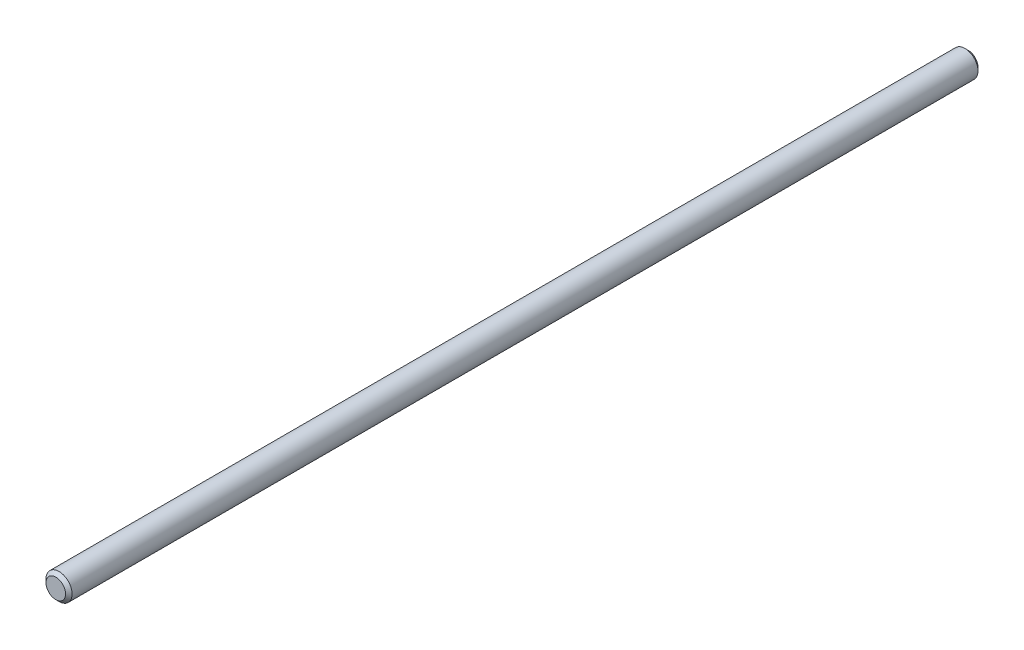
ISO-10303-21;
HEADER;
FILE_DESCRIPTION(('STEP AP214'),'2;1');
FILE_NAME('part.step','',(''),(''),'','','');
FILE_SCHEMA(('AUTOMOTIVE_DESIGN { 1 0 10303 214 1 1 1 1 }'));
ENDSEC;
DATA;
#1=APPLICATION_CONTEXT('core data for automotive mechanical design processes');
#2=APPLICATION_PROTOCOL_DEFINITION('international standard','automotive_design',2000,#1);
#3=PRODUCT_CONTEXT('',#1,'mechanical');
#4=PRODUCT('Part','Part','',(#3));
#5=PRODUCT_RELATED_PRODUCT_CATEGORY('part','',(#4));
#6=PRODUCT_DEFINITION_FORMATION('','',#4);
#7=PRODUCT_DEFINITION_CONTEXT('part definition',#1,'design');
#8=PRODUCT_DEFINITION('design','',#6,#7);
#9=PRODUCT_DEFINITION_SHAPE('','',#8);
#10=(LENGTH_UNIT() NAMED_UNIT(*) SI_UNIT(.MILLI.,.METRE.));
#11=(NAMED_UNIT(*) PLANE_ANGLE_UNIT() SI_UNIT($,.RADIAN.));
#12=(NAMED_UNIT(*) SI_UNIT($,.STERADIAN.) SOLID_ANGLE_UNIT());
#13=UNCERTAINTY_MEASURE_WITH_UNIT(LENGTH_MEASURE(1.E-05),#10,'distance_accuracy_value','');
#14=(GEOMETRIC_REPRESENTATION_CONTEXT(3) GLOBAL_UNCERTAINTY_ASSIGNED_CONTEXT((#13)) GLOBAL_UNIT_ASSIGNED_CONTEXT((#10,
#11,#12)) REPRESENTATION_CONTEXT('',''));
#15=CARTESIAN_POINT('',(0.,0.,0.));
#16=DIRECTION('',(0.,0.,1.));
#17=DIRECTION('',(1.,0.,0.));
#18=AXIS2_PLACEMENT_3D('',#15,#16,#17);
#19=CARTESIAN_POINT('',(0.,0.,280.));
#20=DIRECTION('',(0.,0.,-1.));
#21=DIRECTION('',(-1.,0.,0.));
#22=AXIS2_PLACEMENT_3D('',#19,#20,#21);
#23=CYLINDRICAL_SURFACE('',#22,4.);
#24=CARTESIAN_POINT('',(0.,0.,279.));
#25=DIRECTION('',(0.,0.,1.));
#26=DIRECTION('',(1.,0.,0.));
#27=AXIS2_PLACEMENT_3D('',#24,#25,#26);
#28=CIRCLE('',#27,4.);
#29=CARTESIAN_POINT('',(4.,0.,279.));
#30=VERTEX_POINT('',#29);
#31=EDGE_CURVE('E40',#30,#30,#28,.F.);
#32=ORIENTED_EDGE('',*,*,#31,.T.);
#33=EDGE_LOOP('',(#32));
#34=FACE_BOUND('',#33,.T.);
#35=CARTESIAN_POINT('',(0.,0.,0.999999999999945));
#36=DIRECTION('',(0.,0.,1.));
#37=DIRECTION('',(1.,0.,0.));
#38=AXIS2_PLACEMENT_3D('',#35,#36,#37);
#39=CIRCLE('',#38,4.);
#40=CARTESIAN_POINT('',(4.,0.,0.999999999999945));
#41=VERTEX_POINT('',#40);
#42=EDGE_CURVE('E44',#41,#41,#39,.T.);
#43=ORIENTED_EDGE('',*,*,#42,.T.);
#44=EDGE_LOOP('',(#43));
#45=FACE_BOUND('',#44,.T.);
#46=ADVANCED_FACE('F33',(#34,#45),#23,.T.);
#47=CARTESIAN_POINT('',(0.,0.,280.));
#48=DIRECTION('',(0.,0.,1.));
#49=DIRECTION('',(1.,0.,0.));
#50=AXIS2_PLACEMENT_3D('',#47,#48,#49);
#51=PLANE('',#50);
#52=CARTESIAN_POINT('',(0.,0.,280.));
#53=DIRECTION('',(0.,0.,1.));
#54=DIRECTION('',(1.,0.,0.));
#55=AXIS2_PLACEMENT_3D('',#52,#53,#54);
#56=CIRCLE('',#55,3.);
#57=CARTESIAN_POINT('',(3.,0.,280.));
#58=VERTEX_POINT('',#57);
#59=EDGE_CURVE('E48',#58,#58,#56,.T.);
#60=ORIENTED_EDGE('',*,*,#59,.T.);
#61=EDGE_LOOP('',(#60));
#62=FACE_BOUND('',#61,.T.);
#63=ADVANCED_FACE('F54',(#62),#51,.T.);
#64=CARTESIAN_POINT('',(0.,0.,0.));
#65=DIRECTION('',(0.,0.,1.));
#66=DIRECTION('',(1.,0.,0.));
#67=AXIS2_PLACEMENT_3D('',#64,#65,#66);
#68=PLANE('',#67);
#69=CARTESIAN_POINT('',(0.,0.,0.));
#70=DIRECTION('',(0.,0.,1.));
#71=DIRECTION('',(1.,0.,0.));
#72=AXIS2_PLACEMENT_3D('',#69,#70,#71);
#73=CIRCLE('',#72,3.00000000000003);
#74=CARTESIAN_POINT('',(3.00000000000003,0.,0.));
#75=VERTEX_POINT('',#74);
#76=EDGE_CURVE('E10',#75,#75,#73,.F.);
#77=ORIENTED_EDGE('',*,*,#76,.T.);
#78=EDGE_LOOP('',(#77));
#79=FACE_BOUND('',#78,.T.);
#80=ADVANCED_FACE('F58',(#79),#68,.F.);
#81=CARTESIAN_POINT('',(0.,0.,280.));
#82=DIRECTION('',(0.,0.,-1.));
#83=DIRECTION('',(-1.,0.,0.));
#84=AXIS2_PLACEMENT_3D('',#81,#82,#83);
#85=CONICAL_SURFACE('',#84,3.,0.785398163397447);
#86=ORIENTED_EDGE('',*,*,#31,.F.);
#87=EDGE_LOOP('',(#86));
#88=FACE_BOUND('',#87,.T.);
#89=ORIENTED_EDGE('',*,*,#59,.F.);
#90=EDGE_LOOP('',(#89));
#91=FACE_BOUND('',#90,.T.);
#92=ADVANCED_FACE('F56',(#88,#91),#85,.T.);
#93=CARTESIAN_POINT('',(0.,0.,0.999999999999945));
#94=DIRECTION('',(0.,0.,1.));
#95=DIRECTION('',(1.,0.,0.));
#96=AXIS2_PLACEMENT_3D('',#93,#94,#95);
#97=CONICAL_SURFACE('',#96,4.,0.78539816339746);
#98=ORIENTED_EDGE('',*,*,#76,.F.);
#99=EDGE_LOOP('',(#98));
#100=FACE_BOUND('',#99,.T.);
#101=ORIENTED_EDGE('',*,*,#42,.F.);
#102=EDGE_LOOP('',(#101));
#103=FACE_BOUND('',#102,.T.);
#104=ADVANCED_FACE('F35',(#100,#103),#97,.T.);
#105=CLOSED_SHELL('',(#46,#63,#80,#92,#104));
#106=MANIFOLD_SOLID_BREP('B2',#105);
#107=ADVANCED_BREP_SHAPE_REPRESENTATION('',(#18,#106),#14);
#108=SHAPE_DEFINITION_REPRESENTATION(#9,#107);
ENDSEC;
END-ISO-10303-21;
